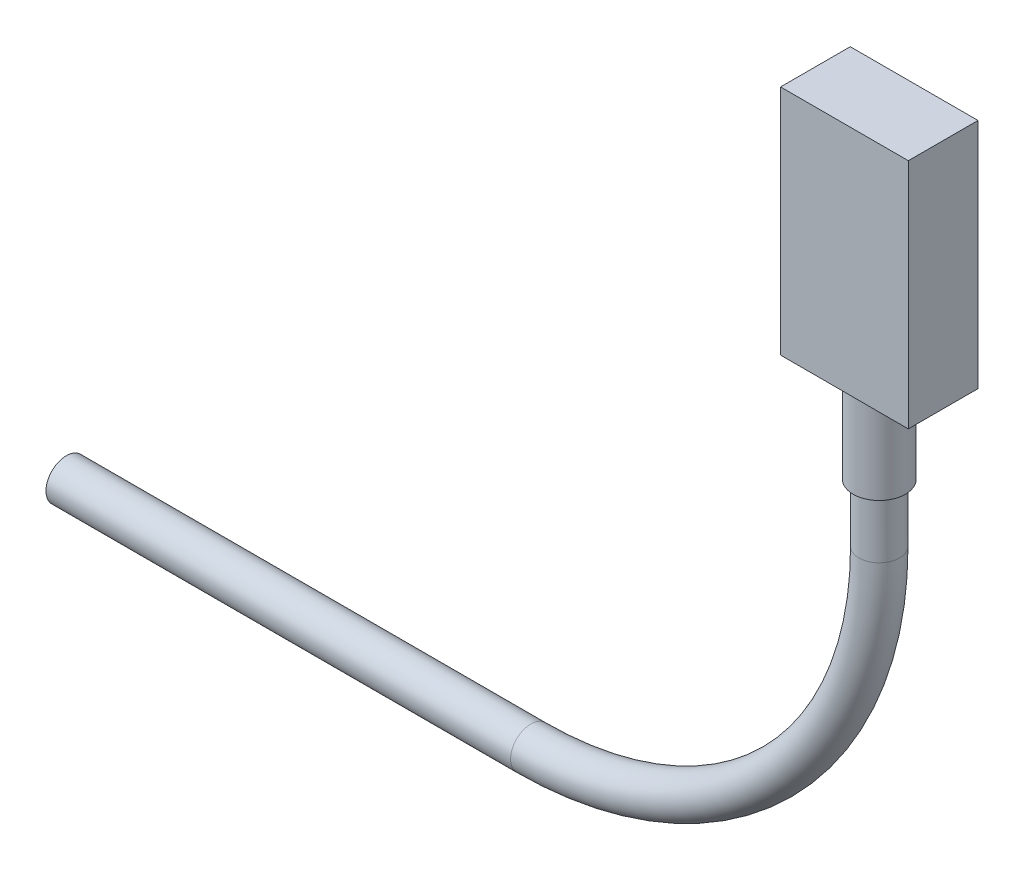
ISO-10303-21;
HEADER;
FILE_DESCRIPTION(('STEP AP214'),'2;1');
FILE_NAME('part.step','',(''),(''),'','','');
FILE_SCHEMA(('AUTOMOTIVE_DESIGN { 1 0 10303 214 1 1 1 1 }'));
ENDSEC;
DATA;
#1=APPLICATION_CONTEXT('core data for automotive mechanical design processes');
#2=APPLICATION_PROTOCOL_DEFINITION('international standard','automotive_design',2000,#1);
#3=PRODUCT_CONTEXT('',#1,'mechanical');
#4=PRODUCT('Part','Part','',(#3));
#5=PRODUCT_RELATED_PRODUCT_CATEGORY('part','',(#4));
#6=PRODUCT_DEFINITION_FORMATION('','',#4);
#7=PRODUCT_DEFINITION_CONTEXT('part definition',#1,'design');
#8=PRODUCT_DEFINITION('design','',#6,#7);
#9=PRODUCT_DEFINITION_SHAPE('','',#8);
#10=(LENGTH_UNIT() NAMED_UNIT(*) SI_UNIT(.MILLI.,.METRE.));
#11=(NAMED_UNIT(*) PLANE_ANGLE_UNIT() SI_UNIT($,.RADIAN.));
#12=(NAMED_UNIT(*) SI_UNIT($,.STERADIAN.) SOLID_ANGLE_UNIT());
#13=UNCERTAINTY_MEASURE_WITH_UNIT(LENGTH_MEASURE(1.E-05),#10,'distance_accuracy_value','');
#14=(GEOMETRIC_REPRESENTATION_CONTEXT(3) GLOBAL_UNCERTAINTY_ASSIGNED_CONTEXT((#13)) GLOBAL_UNIT_ASSIGNED_CONTEXT((#10,
#11,#12)) REPRESENTATION_CONTEXT('',''));
#15=CARTESIAN_POINT('',(0.,0.,0.));
#16=DIRECTION('',(0.,0.,1.));
#17=DIRECTION('',(1.,0.,0.));
#18=AXIS2_PLACEMENT_3D('',#15,#16,#17);
#19=CARTESIAN_POINT('',(-5.5,-20.,-3.));
#20=DIRECTION('',(-1.,0.,0.));
#21=DIRECTION('',(0.,0.,1.));
#22=AXIS2_PLACEMENT_3D('',#19,#20,#21);
#23=PLANE('',#22);
#24=DIRECTION('',(0.,0.,1.));
#25=VECTOR('',#24,1.);
#26=CARTESIAN_POINT('',(-5.5,0.,-3.));
#27=LINE('',#26,#25);
#28=CARTESIAN_POINT('',(-5.5,0.,-3.));
#29=VERTEX_POINT('',#28);
#30=CARTESIAN_POINT('',(-5.5,0.,3.));
#31=VERTEX_POINT('',#30);
#32=EDGE_CURVE('E116',#29,#31,#27,.T.);
#33=ORIENTED_EDGE('',*,*,#32,.F.);
#34=DIRECTION('',(0.,1.,0.));
#35=VECTOR('',#34,1.);
#36=CARTESIAN_POINT('',(-5.5,-20.,-3.));
#37=LINE('',#36,#35);
#38=CARTESIAN_POINT('',(-5.5,-20.,-3.));
#39=VERTEX_POINT('',#38);
#40=EDGE_CURVE('E12',#39,#29,#37,.T.);
#41=ORIENTED_EDGE('',*,*,#40,.F.);
#42=DIRECTION('',(0.,0.,1.));
#43=VECTOR('',#42,1.);
#44=CARTESIAN_POINT('',(-5.5,-20.,-3.));
#45=LINE('',#44,#43);
#46=CARTESIAN_POINT('',(-5.5,-20.,3.));
#47=VERTEX_POINT('',#46);
#48=EDGE_CURVE('E109',#39,#47,#45,.T.);
#49=ORIENTED_EDGE('',*,*,#48,.T.);
#50=DIRECTION('',(0.,1.,0.));
#51=VECTOR('',#50,1.);
#52=CARTESIAN_POINT('',(-5.5,-20.,3.));
#53=LINE('',#52,#51);
#54=EDGE_CURVE('E54',#47,#31,#53,.T.);
#55=ORIENTED_EDGE('',*,*,#54,.T.);
#56=EDGE_LOOP('',(#33,#41,#49,#55));
#57=FACE_BOUND('',#56,.T.);
#58=ADVANCED_FACE('F51',(#57),#23,.T.);
#59=CARTESIAN_POINT('',(-5.5,-20.,-3.));
#60=DIRECTION('',(0.,0.,-1.));
#61=DIRECTION('',(-1.,0.,0.));
#62=AXIS2_PLACEMENT_3D('',#59,#60,#61);
#63=PLANE('',#62);
#64=DIRECTION('',(-1.,0.,0.));
#65=VECTOR('',#64,1.);
#66=CARTESIAN_POINT('',(-5.5,0.,-3.));
#67=LINE('',#66,#65);
#68=CARTESIAN_POINT('',(5.5,0.,-3.));
#69=VERTEX_POINT('',#68);
#70=EDGE_CURVE('E111',#69,#29,#67,.T.);
#71=ORIENTED_EDGE('',*,*,#70,.F.);
#72=DIRECTION('',(0.,1.,0.));
#73=VECTOR('',#72,1.);
#74=CARTESIAN_POINT('',(5.5,-20.,-3.));
#75=LINE('',#74,#73);
#76=CARTESIAN_POINT('',(5.5,-20.,-3.));
#77=VERTEX_POINT('',#76);
#78=EDGE_CURVE('E60',#77,#69,#75,.T.);
#79=ORIENTED_EDGE('',*,*,#78,.F.);
#80=DIRECTION('',(-1.,0.,0.));
#81=VECTOR('',#80,1.);
#82=CARTESIAN_POINT('',(-5.5,-20.,-3.));
#83=LINE('',#82,#81);
#84=EDGE_CURVE('E106',#77,#39,#83,.T.);
#85=ORIENTED_EDGE('',*,*,#84,.T.);
#86=ORIENTED_EDGE('',*,*,#40,.T.);
#87=EDGE_LOOP('',(#71,#79,#85,#86));
#88=FACE_BOUND('',#87,.T.);
#89=ADVANCED_FACE('F127',(#88),#63,.T.);
#90=CARTESIAN_POINT('',(5.5,-20.,-3.));
#91=DIRECTION('',(1.,0.,0.));
#92=DIRECTION('',(0.,0.,-1.));
#93=AXIS2_PLACEMENT_3D('',#90,#91,#92);
#94=PLANE('',#93);
#95=DIRECTION('',(0.,0.,-1.));
#96=VECTOR('',#95,1.);
#97=CARTESIAN_POINT('',(5.5,0.,-3.));
#98=LINE('',#97,#96);
#99=CARTESIAN_POINT('',(5.5,0.,3.));
#100=VERTEX_POINT('',#99);
#101=EDGE_CURVE('E101',#100,#69,#98,.T.);
#102=ORIENTED_EDGE('',*,*,#101,.F.);
#103=DIRECTION('',(0.,1.,0.));
#104=VECTOR('',#103,1.);
#105=CARTESIAN_POINT('',(5.5,-20.,3.));
#106=LINE('',#105,#104);
#107=CARTESIAN_POINT('',(5.5,-20.,3.));
#108=VERTEX_POINT('',#107);
#109=EDGE_CURVE('E96',#108,#100,#106,.T.);
#110=ORIENTED_EDGE('',*,*,#109,.F.);
#111=DIRECTION('',(0.,0.,-1.));
#112=VECTOR('',#111,1.);
#113=CARTESIAN_POINT('',(5.5,-20.,-3.));
#114=LINE('',#113,#112);
#115=EDGE_CURVE('E99',#108,#77,#114,.T.);
#116=ORIENTED_EDGE('',*,*,#115,.T.);
#117=ORIENTED_EDGE('',*,*,#78,.T.);
#118=EDGE_LOOP('',(#102,#110,#116,#117));
#119=FACE_BOUND('',#118,.T.);
#120=ADVANCED_FACE('F98',(#119),#94,.T.);
#121=CARTESIAN_POINT('',(-5.5,-20.,3.));
#122=DIRECTION('',(0.,0.,1.));
#123=DIRECTION('',(1.,0.,0.));
#124=AXIS2_PLACEMENT_3D('',#121,#122,#123);
#125=PLANE('',#124);
#126=DIRECTION('',(1.,0.,0.));
#127=VECTOR('',#126,1.);
#128=CARTESIAN_POINT('',(-5.5,0.,3.));
#129=LINE('',#128,#127);
#130=EDGE_CURVE('E119',#31,#100,#129,.T.);
#131=ORIENTED_EDGE('',*,*,#130,.F.);
#132=ORIENTED_EDGE('',*,*,#54,.F.);
#133=DIRECTION('',(1.,0.,0.));
#134=VECTOR('',#133,1.);
#135=CARTESIAN_POINT('',(-5.5,-20.,3.));
#136=LINE('',#135,#134);
#137=EDGE_CURVE('E105',#47,#108,#136,.T.);
#138=ORIENTED_EDGE('',*,*,#137,.T.);
#139=ORIENTED_EDGE('',*,*,#109,.T.);
#140=EDGE_LOOP('',(#131,#132,#138,#139));
#141=FACE_BOUND('',#140,.T.);
#142=ADVANCED_FACE('F108',(#141),#125,.T.);
#143=CARTESIAN_POINT('',(0.,-20.,0.));
#144=DIRECTION('',(0.,1.,0.));
#145=DIRECTION('',(0.,0.,1.));
#146=AXIS2_PLACEMENT_3D('',#143,#144,#145);
#147=PLANE('',#146);
#148=CARTESIAN_POINT('',(0.,-20.,0.));
#149=DIRECTION('',(0.,1.,0.));
#150=DIRECTION('',(0.,0.,1.));
#151=AXIS2_PLACEMENT_3D('',#148,#149,#150);
#152=CIRCLE('',#151,2.25);
#153=CARTESIAN_POINT('',(0.,-20.,2.25));
#154=VERTEX_POINT('',#153);
#155=EDGE_CURVE('E188',#154,#154,#152,.T.);
#156=ORIENTED_EDGE('',*,*,#155,.T.);
#157=EDGE_LOOP('',(#156));
#158=FACE_BOUND('',#157,.T.);
#159=ORIENTED_EDGE('',*,*,#48,.F.);
#160=ORIENTED_EDGE('',*,*,#84,.F.);
#161=ORIENTED_EDGE('',*,*,#115,.F.);
#162=ORIENTED_EDGE('',*,*,#137,.F.);
#163=EDGE_LOOP('',(#159,#160,#161,#162));
#164=FACE_BOUND('',#163,.T.);
#165=ADVANCED_FACE('F104',(#158,#164),#147,.F.);
#166=CARTESIAN_POINT('',(0.,0.,0.));
#167=DIRECTION('',(0.,1.,0.));
#168=DIRECTION('',(0.,0.,1.));
#169=AXIS2_PLACEMENT_3D('',#166,#167,#168);
#170=PLANE('',#169);
#171=ORIENTED_EDGE('',*,*,#32,.T.);
#172=ORIENTED_EDGE('',*,*,#130,.T.);
#173=ORIENTED_EDGE('',*,*,#101,.T.);
#174=ORIENTED_EDGE('',*,*,#70,.T.);
#175=EDGE_LOOP('',(#171,#172,#173,#174));
#176=FACE_BOUND('',#175,.T.);
#177=ADVANCED_FACE('F126',(#176),#170,.T.);
#178=CARTESIAN_POINT('',(0.,-28.,0.));
#179=DIRECTION('',(0.,1.,0.));
#180=DIRECTION('',(0.,0.,1.));
#181=AXIS2_PLACEMENT_3D('',#178,#179,#180);
#182=CYLINDRICAL_SURFACE('',#181,2.25);
#183=CARTESIAN_POINT('',(0.,-28.,0.));
#184=DIRECTION('',(0.,1.,0.));
#185=DIRECTION('',(0.,0.,1.));
#186=AXIS2_PLACEMENT_3D('',#183,#184,#185);
#187=CIRCLE('',#186,2.25);
#188=CARTESIAN_POINT('',(0.,-28.,2.25));
#189=VERTEX_POINT('',#188);
#190=EDGE_CURVE('E120',#189,#189,#187,.T.);
#191=ORIENTED_EDGE('',*,*,#190,.T.);
#192=EDGE_LOOP('',(#191));
#193=FACE_BOUND('',#192,.T.);
#194=ORIENTED_EDGE('',*,*,#155,.F.);
#195=EDGE_LOOP('',(#194));
#196=FACE_BOUND('',#195,.T.);
#197=ADVANCED_FACE('F146',(#193,#196),#182,.T.);
#198=CARTESIAN_POINT('',(0.,-28.,0.));
#199=DIRECTION('',(0.,1.,0.));
#200=DIRECTION('',(0.,0.,1.));
#201=AXIS2_PLACEMENT_3D('',#198,#199,#200);
#202=PLANE('',#201);
#203=CARTESIAN_POINT('',(0.,-28.,0.));
#204=DIRECTION('',(0.,1.,0.));
#205=DIRECTION('',(0.,0.,-1.));
#206=AXIS2_PLACEMENT_3D('',#203,#204,#205);
#207=CIRCLE('',#206,1.75);
#208=CARTESIAN_POINT('',(0.,-28.,-1.75));
#209=VERTEX_POINT('',#208);
#210=EDGE_CURVE('E178',#209,#209,#207,.T.);
#211=ORIENTED_EDGE('',*,*,#210,.T.);
#212=EDGE_LOOP('',(#211));
#213=FACE_BOUND('',#212,.T.);
#214=ORIENTED_EDGE('',*,*,#190,.F.);
#215=EDGE_LOOP('',(#214));
#216=FACE_BOUND('',#215,.T.);
#217=ADVANCED_FACE('F150',(#213,#216),#202,.F.);
#218=CARTESIAN_POINT('',(-70.,-63.,0.));
#219=DIRECTION('',(1.,0.,0.));
#220=DIRECTION('',(0.,0.,-1.));
#221=AXIS2_PLACEMENT_3D('',#218,#219,#220);
#222=PLANE('',#221);
#223=CARTESIAN_POINT('',(-70.,-63.,0.));
#224=DIRECTION('',(1.,0.,0.));
#225=DIRECTION('',(0.,0.,-1.));
#226=AXIS2_PLACEMENT_3D('',#223,#224,#225);
#227=CIRCLE('',#226,1.75);
#228=CARTESIAN_POINT('',(-70.,-63.,-1.75));
#229=VERTEX_POINT('',#228);
#230=EDGE_CURVE('E185',#229,#229,#227,.T.);
#231=ORIENTED_EDGE('',*,*,#230,.F.);
#232=EDGE_LOOP('',(#231));
#233=FACE_BOUND('',#232,.T.);
#234=ADVANCED_FACE('F154',(#233),#222,.F.);
#235=CARTESIAN_POINT('',(0.,-28.,0.));
#236=DIRECTION('',(0.,-1.,0.));
#237=DIRECTION('',(0.,0.,-1.));
#238=AXIS2_PLACEMENT_3D('',#235,#236,#237);
#239=CYLINDRICAL_SURFACE('',#238,1.75);
#240=CARTESIAN_POINT('',(0.,-33.,0.));
#241=DIRECTION('',(0.,1.,0.));
#242=DIRECTION('',(0.,0.,-1.));
#243=AXIS2_PLACEMENT_3D('',#240,#241,#242);
#244=CIRCLE('',#243,1.75);
#245=CARTESIAN_POINT('',(1.75,-33.,0.));
#246=VERTEX_POINT('',#245);
#247=EDGE_CURVE('E175',#246,#246,#244,.T.);
#248=ORIENTED_EDGE('',*,*,#247,.T.);
#249=EDGE_LOOP('',(#248));
#250=FACE_BOUND('',#249,.T.);
#251=ORIENTED_EDGE('',*,*,#210,.F.);
#252=EDGE_LOOP('',(#251));
#253=FACE_BOUND('',#252,.T.);
#254=ADVANCED_FACE('F159',(#250,#253),#239,.T.);
#255=CARTESIAN_POINT('',(-30.,-33.,0.));
#256=DIRECTION('',(0.,0.,-1.));
#257=DIRECTION('',(-1.,0.,0.));
#258=AXIS2_PLACEMENT_3D('',#255,#256,#257);
#259=TOROIDAL_SURFACE('',#258,30.,1.75);
#260=CARTESIAN_POINT('',(-30.,-63.,0.));
#261=DIRECTION('',(1.,0.,0.));
#262=DIRECTION('',(0.,0.,-1.));
#263=AXIS2_PLACEMENT_3D('',#260,#261,#262);
#264=CIRCLE('',#263,1.75);
#265=CARTESIAN_POINT('',(-30.,-64.75,0.));
#266=VERTEX_POINT('',#265);
#267=EDGE_CURVE('E180',#266,#266,#264,.T.);
#268=CARTESIAN_POINT('',(-30.,-33.,0.));
#269=DIRECTION('',(0.,0.,-1.));
#270=DIRECTION('',(-1.,0.,0.));
#271=AXIS2_PLACEMENT_3D('',#268,#269,#270);
#272=CIRCLE('',#271,31.75);
#273=EDGE_CURVE('',#246,#266,#272,.T.);
#274=ORIENTED_EDGE('',*,*,#247,.F.);
#275=ORIENTED_EDGE('',*,*,#267,.T.);
#276=ORIENTED_EDGE('',*,*,#273,.T.);
#277=ORIENTED_EDGE('',*,*,#273,.F.);
#278=EDGE_LOOP('',(#274,#276,#275,#277));
#279=FACE_BOUND('',#278,.T.);
#280=ADVANCED_FACE('F163',(#279),#259,.T.);
#281=CARTESIAN_POINT('',(-30.,-63.,0.));
#282=DIRECTION('',(-1.,0.,0.));
#283=DIRECTION('',(0.,0.,1.));
#284=AXIS2_PLACEMENT_3D('',#281,#282,#283);
#285=CYLINDRICAL_SURFACE('',#284,1.75);
#286=ORIENTED_EDGE('',*,*,#230,.T.);
#287=EDGE_LOOP('',(#286));
#288=FACE_BOUND('',#287,.T.);
#289=ORIENTED_EDGE('',*,*,#267,.F.);
#290=EDGE_LOOP('',(#289));
#291=FACE_BOUND('',#290,.T.);
#292=ADVANCED_FACE('F156',(#288,#291),#285,.T.);
#293=CLOSED_SHELL('',(#58,#89,#120,#142,#165,#177,#197,#217,#234,#254,#280,#292));
#294=MANIFOLD_SOLID_BREP('B2',#293);
#295=ADVANCED_BREP_SHAPE_REPRESENTATION('',(#18,#294),#14);
#296=SHAPE_DEFINITION_REPRESENTATION(#9,#295);
ENDSEC;
END-ISO-10303-21;
